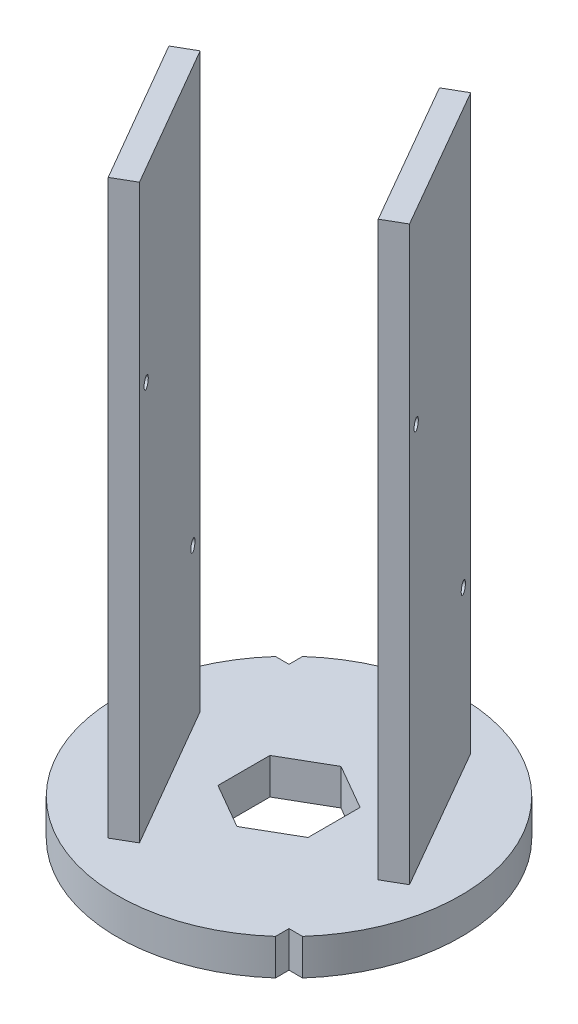
ISO-10303-21;
HEADER;
FILE_DESCRIPTION(('STEP AP214'),'2;1');
FILE_NAME('part.step','',(''),(''),'','','');
FILE_SCHEMA(('AUTOMOTIVE_DESIGN { 1 0 10303 214 1 1 1 1 }'));
ENDSEC;
DATA;
#1=APPLICATION_CONTEXT('core data for automotive mechanical design processes');
#2=APPLICATION_PROTOCOL_DEFINITION('international standard','automotive_design',2000,#1);
#3=PRODUCT_CONTEXT('',#1,'mechanical');
#4=PRODUCT('Part','Part','',(#3));
#5=PRODUCT_RELATED_PRODUCT_CATEGORY('part','',(#4));
#6=PRODUCT_DEFINITION_FORMATION('','',#4);
#7=PRODUCT_DEFINITION_CONTEXT('part definition',#1,'design');
#8=PRODUCT_DEFINITION('design','',#6,#7);
#9=PRODUCT_DEFINITION_SHAPE('','',#8);
#10=(LENGTH_UNIT() NAMED_UNIT(*) SI_UNIT(.MILLI.,.METRE.));
#11=(NAMED_UNIT(*) PLANE_ANGLE_UNIT() SI_UNIT($,.RADIAN.));
#12=(NAMED_UNIT(*) SI_UNIT($,.STERADIAN.) SOLID_ANGLE_UNIT());
#13=UNCERTAINTY_MEASURE_WITH_UNIT(LENGTH_MEASURE(1.E-05),#10,'distance_accuracy_value','');
#14=(GEOMETRIC_REPRESENTATION_CONTEXT(3) GLOBAL_UNCERTAINTY_ASSIGNED_CONTEXT((#13)) GLOBAL_UNIT_ASSIGNED_CONTEXT((#10,
#11,#12)) REPRESENTATION_CONTEXT('',''));
#15=CARTESIAN_POINT('',(0.,0.,0.));
#16=DIRECTION('',(0.,0.,1.));
#17=DIRECTION('',(1.,0.,0.));
#18=AXIS2_PLACEMENT_3D('',#15,#16,#17);
#19=CARTESIAN_POINT('',(5.00000000000001,8.,-8.6602540378444));
#20=DIRECTION('',(-0.5,0.,0.866025403784439));
#21=DIRECTION('',(0.866025403784439,0.,0.5));
#22=AXIS2_PLACEMENT_3D('',#19,#20,#21);
#23=PLANE('',#22);
#24=DIRECTION('',(-0.866025403784439,0.,-0.5));
#25=VECTOR('',#24,1.);
#26=CARTESIAN_POINT('',(5.00000000000001,0.,-8.6602540378444));
#27=LINE('',#26,#25);
#28=CARTESIAN_POINT('',(10.,0.,-5.77350269189628));
#29=VERTEX_POINT('',#28);
#30=CARTESIAN_POINT('',(0.,0.,-11.5470053837925));
#31=VERTEX_POINT('',#30);
#32=EDGE_CURVE('E347',#29,#31,#27,.T.);
#33=ORIENTED_EDGE('',*,*,#32,.F.);
#34=DIRECTION('',(0.,-1.,0.));
#35=VECTOR('',#34,1.);
#36=CARTESIAN_POINT('',(10.,8.,-5.77350269189628));
#37=LINE('',#36,#35);
#38=CARTESIAN_POINT('',(10.,8.,-5.77350269189628));
#39=VERTEX_POINT('',#38);
#40=EDGE_CURVE('E11',#39,#29,#37,.T.);
#41=ORIENTED_EDGE('',*,*,#40,.F.);
#42=DIRECTION('',(-0.866025403784439,0.,-0.5));
#43=VECTOR('',#42,1.);
#44=CARTESIAN_POINT('',(5.00000000000001,8.,-8.6602540378444));
#45=LINE('',#44,#43);
#46=CARTESIAN_POINT('',(0.,8.,-11.5470053837925));
#47=VERTEX_POINT('',#46);
#48=EDGE_CURVE('E300',#39,#47,#45,.T.);
#49=ORIENTED_EDGE('',*,*,#48,.T.);
#50=DIRECTION('',(0.,-1.,0.));
#51=VECTOR('',#50,1.);
#52=CARTESIAN_POINT('',(0.,8.,-11.5470053837925));
#53=LINE('',#52,#51);
#54=EDGE_CURVE('E370',#47,#31,#53,.T.);
#55=ORIENTED_EDGE('',*,*,#54,.T.);
#56=EDGE_LOOP('',(#33,#41,#49,#55));
#57=FACE_BOUND('',#56,.T.);
#58=ADVANCED_FACE('F43',(#57),#23,.T.);
#59=CARTESIAN_POINT('',(10.,8.,0.));
#60=DIRECTION('',(-1.,0.,0.));
#61=DIRECTION('',(0.,0.,1.));
#62=AXIS2_PLACEMENT_3D('',#59,#60,#61);
#63=PLANE('',#62);
#64=DIRECTION('',(0.,0.,-1.));
#65=VECTOR('',#64,1.);
#66=CARTESIAN_POINT('',(10.,0.,0.));
#67=LINE('',#66,#65);
#68=CARTESIAN_POINT('',(9.99999999999999,0.,5.77350269189625));
#69=VERTEX_POINT('',#68);
#70=EDGE_CURVE('E351',#69,#29,#67,.T.);
#71=ORIENTED_EDGE('',*,*,#70,.F.);
#72=DIRECTION('',(0.,-1.,0.));
#73=VECTOR('',#72,1.);
#74=CARTESIAN_POINT('',(9.99999999999999,8.,5.77350269189625));
#75=LINE('',#74,#73);
#76=CARTESIAN_POINT('',(9.99999999999999,8.,5.77350269189625));
#77=VERTEX_POINT('',#76);
#78=EDGE_CURVE('E53',#77,#69,#75,.T.);
#79=ORIENTED_EDGE('',*,*,#78,.F.);
#80=DIRECTION('',(0.,0.,-1.));
#81=VECTOR('',#80,1.);
#82=CARTESIAN_POINT('',(10.,8.,0.));
#83=LINE('',#82,#81);
#84=EDGE_CURVE('E304',#77,#39,#83,.T.);
#85=ORIENTED_EDGE('',*,*,#84,.T.);
#86=ORIENTED_EDGE('',*,*,#40,.T.);
#87=EDGE_LOOP('',(#71,#79,#85,#86));
#88=FACE_BOUND('',#87,.T.);
#89=ADVANCED_FACE('F441',(#88),#63,.T.);
#90=CARTESIAN_POINT('',(4.99999999999999,8.,8.66025403784438));
#91=DIRECTION('',(-0.5,0.,-0.866025403784439));
#92=DIRECTION('',(-0.866025403784439,0.,0.5));
#93=AXIS2_PLACEMENT_3D('',#90,#91,#92);
#94=PLANE('',#93);
#95=DIRECTION('',(0.866025403784439,0.,-0.5));
#96=VECTOR('',#95,1.);
#97=CARTESIAN_POINT('',(4.99999999999999,0.,8.66025403784438));
#98=LINE('',#97,#96);
#99=CARTESIAN_POINT('',(0.,0.,11.5470053837925));
#100=VERTEX_POINT('',#99);
#101=EDGE_CURVE('E355',#100,#69,#98,.T.);
#102=ORIENTED_EDGE('',*,*,#101,.F.);
#103=DIRECTION('',(0.,-1.,0.));
#104=VECTOR('',#103,1.);
#105=CARTESIAN_POINT('',(0.,8.,11.5470053837925));
#106=LINE('',#105,#104);
#107=CARTESIAN_POINT('',(0.,8.,11.5470053837925));
#108=VERTEX_POINT('',#107);
#109=EDGE_CURVE('E379',#108,#100,#106,.T.);
#110=ORIENTED_EDGE('',*,*,#109,.F.);
#111=DIRECTION('',(0.866025403784439,0.,-0.5));
#112=VECTOR('',#111,1.);
#113=CARTESIAN_POINT('',(4.99999999999999,8.,8.66025403784438));
#114=LINE('',#113,#112);
#115=EDGE_CURVE('E308',#108,#77,#114,.T.);
#116=ORIENTED_EDGE('',*,*,#115,.T.);
#117=ORIENTED_EDGE('',*,*,#78,.T.);
#118=EDGE_LOOP('',(#102,#110,#116,#117));
#119=FACE_BOUND('',#118,.T.);
#120=ADVANCED_FACE('F445',(#119),#94,.T.);
#121=CARTESIAN_POINT('',(-5.,8.,8.66025403784438));
#122=DIRECTION('',(0.5,0.,-0.866025403784439));
#123=DIRECTION('',(-0.866025403784439,0.,-0.5));
#124=AXIS2_PLACEMENT_3D('',#121,#122,#123);
#125=PLANE('',#124);
#126=DIRECTION('',(0.866025403784439,0.,0.5));
#127=VECTOR('',#126,1.);
#128=CARTESIAN_POINT('',(-5.,0.,8.66025403784438));
#129=LINE('',#128,#127);
#130=CARTESIAN_POINT('',(-10.,0.,5.77350269189625));
#131=VERTEX_POINT('',#130);
#132=EDGE_CURVE('E359',#131,#100,#129,.T.);
#133=ORIENTED_EDGE('',*,*,#132,.F.);
#134=DIRECTION('',(0.,-1.,0.));
#135=VECTOR('',#134,1.);
#136=CARTESIAN_POINT('',(-10.,8.,5.77350269189625));
#137=LINE('',#136,#135);
#138=CARTESIAN_POINT('',(-10.,8.,5.77350269189625));
#139=VERTEX_POINT('',#138);
#140=EDGE_CURVE('E376',#139,#131,#137,.T.);
#141=ORIENTED_EDGE('',*,*,#140,.F.);
#142=DIRECTION('',(0.866025403784439,0.,0.5));
#143=VECTOR('',#142,1.);
#144=CARTESIAN_POINT('',(-5.,8.,8.66025403784438));
#145=LINE('',#144,#143);
#146=EDGE_CURVE('E312',#139,#108,#145,.T.);
#147=ORIENTED_EDGE('',*,*,#146,.T.);
#148=ORIENTED_EDGE('',*,*,#109,.T.);
#149=EDGE_LOOP('',(#133,#141,#147,#148));
#150=FACE_BOUND('',#149,.T.);
#151=ADVANCED_FACE('F449',(#150),#125,.T.);
#152=CARTESIAN_POINT('',(-10.,8.,0.));
#153=DIRECTION('',(1.,0.,0.));
#154=DIRECTION('',(0.,0.,-1.));
#155=AXIS2_PLACEMENT_3D('',#152,#153,#154);
#156=PLANE('',#155);
#157=DIRECTION('',(0.,0.,1.));
#158=VECTOR('',#157,1.);
#159=CARTESIAN_POINT('',(-10.,0.,0.));
#160=LINE('',#159,#158);
#161=CARTESIAN_POINT('',(-10.,0.,-5.77350269189628));
#162=VERTEX_POINT('',#161);
#163=EDGE_CURVE('E363',#162,#131,#160,.T.);
#164=ORIENTED_EDGE('',*,*,#163,.F.);
#165=DIRECTION('',(0.,-1.,0.));
#166=VECTOR('',#165,1.);
#167=CARTESIAN_POINT('',(-10.,8.,-5.77350269189628));
#168=LINE('',#167,#166);
#169=CARTESIAN_POINT('',(-10.,8.,-5.77350269189628));
#170=VERTEX_POINT('',#169);
#171=EDGE_CURVE('E373',#170,#162,#168,.T.);
#172=ORIENTED_EDGE('',*,*,#171,.F.);
#173=DIRECTION('',(0.,0.,1.));
#174=VECTOR('',#173,1.);
#175=CARTESIAN_POINT('',(-10.,8.,0.));
#176=LINE('',#175,#174);
#177=EDGE_CURVE('E316',#170,#139,#176,.T.);
#178=ORIENTED_EDGE('',*,*,#177,.T.);
#179=ORIENTED_EDGE('',*,*,#140,.T.);
#180=EDGE_LOOP('',(#164,#172,#178,#179));
#181=FACE_BOUND('',#180,.T.);
#182=ADVANCED_FACE('F452',(#181),#156,.T.);
#183=CARTESIAN_POINT('',(0.,8.,-25.4));
#184=DIRECTION('',(0.,0.,1.));
#185=DIRECTION('',(1.,0.,0.));
#186=AXIS2_PLACEMENT_3D('',#183,#184,#185);
#187=PLANE('',#186);
#188=DIRECTION('',(-1.,0.,0.));
#189=VECTOR('',#188,1.);
#190=CARTESIAN_POINT('',(0.,0.,-25.4));
#191=LINE('',#190,#189);
#192=CARTESIAN_POINT('',(-25.4,0.,-25.4));
#193=VERTEX_POINT('',#192);
#194=CARTESIAN_POINT('',(-28.3980633142473,0.,-25.4));
#195=VERTEX_POINT('',#194);
#196=EDGE_CURVE('E277',#193,#195,#191,.T.);
#197=ORIENTED_EDGE('',*,*,#196,.T.);
#198=DIRECTION('',(0.,-1.,0.));
#199=VECTOR('',#198,1.);
#200=CARTESIAN_POINT('',(-28.3980633142473,8.,-25.4));
#201=LINE('',#200,#199);
#202=CARTESIAN_POINT('',(-28.3980633142473,8.,-25.4));
#203=VERTEX_POINT('',#202);
#204=EDGE_CURVE('E47',#203,#195,#201,.T.);
#205=ORIENTED_EDGE('',*,*,#204,.F.);
#206=DIRECTION('',(-1.,0.,0.));
#207=VECTOR('',#206,1.);
#208=CARTESIAN_POINT('',(0.,8.,-25.4));
#209=LINE('',#208,#207);
#210=CARTESIAN_POINT('',(-25.4,8.,-25.4));
#211=VERTEX_POINT('',#210);
#212=EDGE_CURVE('E278',#211,#203,#209,.T.);
#213=ORIENTED_EDGE('',*,*,#212,.F.);
#214=DIRECTION('',(0.,-1.,0.));
#215=VECTOR('',#214,1.);
#216=CARTESIAN_POINT('',(-25.4,8.,-25.4));
#217=LINE('',#216,#215);
#218=EDGE_CURVE('E324',#211,#193,#217,.T.);
#219=ORIENTED_EDGE('',*,*,#218,.T.);
#220=EDGE_LOOP('',(#197,#205,#213,#219));
#221=FACE_BOUND('',#220,.T.);
#222=ADVANCED_FACE('F45',(#221),#187,.F.);
#223=CARTESIAN_POINT('',(0.,8.,0.));
#224=DIRECTION('',(0.,-1.,0.));
#225=DIRECTION('',(0.,0.,-1.));
#226=AXIS2_PLACEMENT_3D('',#223,#224,#225);
#227=CYLINDRICAL_SURFACE('',#226,38.1);
#228=CARTESIAN_POINT('',(0.,0.,0.));
#229=DIRECTION('',(0.,1.,0.));
#230=DIRECTION('',(0.,0.,1.));
#231=AXIS2_PLACEMENT_3D('',#228,#229,#230);
#232=CIRCLE('',#231,38.1);
#233=CARTESIAN_POINT('',(25.4,0.,28.3980633142473));
#234=VERTEX_POINT('',#233);
#235=EDGE_CURVE('E328',#195,#234,#232,.T.);
#236=ORIENTED_EDGE('',*,*,#235,.T.);
#237=DIRECTION('',(0.,-1.,0.));
#238=VECTOR('',#237,1.);
#239=CARTESIAN_POINT('',(25.4,8.,28.3980633142473));
#240=LINE('',#239,#238);
#241=CARTESIAN_POINT('',(25.4,8.,28.3980633142473));
#242=VERTEX_POINT('',#241);
#243=EDGE_CURVE('E395',#242,#234,#240,.T.);
#244=ORIENTED_EDGE('',*,*,#243,.F.);
#245=CARTESIAN_POINT('',(0.,8.,0.));
#246=DIRECTION('',(0.,1.,0.));
#247=DIRECTION('',(0.,0.,1.));
#248=AXIS2_PLACEMENT_3D('',#245,#246,#247);
#249=CIRCLE('',#248,38.1);
#250=EDGE_CURVE('E282',#203,#242,#249,.T.);
#251=ORIENTED_EDGE('',*,*,#250,.F.);
#252=ORIENTED_EDGE('',*,*,#204,.T.);
#253=EDGE_LOOP('',(#236,#244,#251,#252));
#254=FACE_BOUND('',#253,.T.);
#255=ADVANCED_FACE('F404',(#254),#227,.T.);
#256=CARTESIAN_POINT('',(25.4,8.,0.));
#257=DIRECTION('',(1.,0.,0.));
#258=DIRECTION('',(0.,0.,-1.));
#259=AXIS2_PLACEMENT_3D('',#256,#257,#258);
#260=PLANE('',#259);
#261=DIRECTION('',(0.,0.,1.));
#262=VECTOR('',#261,1.);
#263=CARTESIAN_POINT('',(25.4,0.,0.));
#264=LINE('',#263,#262);
#265=CARTESIAN_POINT('',(25.4,0.,25.4));
#266=VERTEX_POINT('',#265);
#267=EDGE_CURVE('E332',#266,#234,#264,.T.);
#268=ORIENTED_EDGE('',*,*,#267,.F.);
#269=DIRECTION('',(0.,-1.,0.));
#270=VECTOR('',#269,1.);
#271=CARTESIAN_POINT('',(25.4,8.,25.4));
#272=LINE('',#271,#270);
#273=CARTESIAN_POINT('',(25.4,8.,25.4));
#274=VERTEX_POINT('',#273);
#275=EDGE_CURVE('E393',#274,#266,#272,.T.);
#276=ORIENTED_EDGE('',*,*,#275,.F.);
#277=DIRECTION('',(0.,0.,1.));
#278=VECTOR('',#277,1.);
#279=CARTESIAN_POINT('',(25.4,8.,0.));
#280=LINE('',#279,#278);
#281=EDGE_CURVE('E286',#274,#242,#280,.T.);
#282=ORIENTED_EDGE('',*,*,#281,.T.);
#283=ORIENTED_EDGE('',*,*,#243,.T.);
#284=EDGE_LOOP('',(#268,#276,#282,#283));
#285=FACE_BOUND('',#284,.T.);
#286=ADVANCED_FACE('F423',(#285),#260,.T.);
#287=CARTESIAN_POINT('',(0.,8.,25.4));
#288=DIRECTION('',(0.,0.,-1.));
#289=DIRECTION('',(-1.,0.,0.));
#290=AXIS2_PLACEMENT_3D('',#287,#288,#289);
#291=PLANE('',#290);
#292=DIRECTION('',(1.,0.,0.));
#293=VECTOR('',#292,1.);
#294=CARTESIAN_POINT('',(0.,0.,25.4));
#295=LINE('',#294,#293);
#296=CARTESIAN_POINT('',(28.3980633142473,0.,25.4));
#297=VERTEX_POINT('',#296);
#298=EDGE_CURVE('E336',#266,#297,#295,.T.);
#299=ORIENTED_EDGE('',*,*,#298,.T.);
#300=DIRECTION('',(0.,-1.,0.));
#301=VECTOR('',#300,1.);
#302=CARTESIAN_POINT('',(28.3980633142473,8.,25.4));
#303=LINE('',#302,#301);
#304=CARTESIAN_POINT('',(28.3980633142473,8.,25.4));
#305=VERTEX_POINT('',#304);
#306=EDGE_CURVE('E389',#305,#297,#303,.T.);
#307=ORIENTED_EDGE('',*,*,#306,.F.);
#308=DIRECTION('',(1.,0.,0.));
#309=VECTOR('',#308,1.);
#310=CARTESIAN_POINT('',(0.,8.,25.4));
#311=LINE('',#310,#309);
#312=EDGE_CURVE('E290',#274,#305,#311,.T.);
#313=ORIENTED_EDGE('',*,*,#312,.F.);
#314=ORIENTED_EDGE('',*,*,#275,.T.);
#315=EDGE_LOOP('',(#299,#307,#313,#314));
#316=FACE_BOUND('',#315,.T.);
#317=ADVANCED_FACE('F426',(#316),#291,.F.);
#318=CARTESIAN_POINT('',(0.,8.,0.));
#319=DIRECTION('',(0.,-1.,0.));
#320=DIRECTION('',(0.,0.,-1.));
#321=AXIS2_PLACEMENT_3D('',#318,#319,#320);
#322=CYLINDRICAL_SURFACE('',#321,38.1);
#323=CARTESIAN_POINT('',(0.,0.,0.));
#324=DIRECTION('',(0.,1.,0.));
#325=DIRECTION('',(0.,0.,1.));
#326=AXIS2_PLACEMENT_3D('',#323,#324,#325);
#327=CIRCLE('',#326,38.1);
#328=CARTESIAN_POINT('',(-25.4,0.,-28.3980633142473));
#329=VERTEX_POINT('',#328);
#330=EDGE_CURVE('E339',#297,#329,#327,.T.);
#331=ORIENTED_EDGE('',*,*,#330,.T.);
#332=DIRECTION('',(0.,-1.,0.));
#333=VECTOR('',#332,1.);
#334=CARTESIAN_POINT('',(-25.4,8.,-28.3980633142473));
#335=LINE('',#334,#333);
#336=CARTESIAN_POINT('',(-25.4,8.,-28.3980633142473));
#337=VERTEX_POINT('',#336);
#338=EDGE_CURVE('E386',#337,#329,#335,.T.);
#339=ORIENTED_EDGE('',*,*,#338,.F.);
#340=CARTESIAN_POINT('',(0.,8.,0.));
#341=DIRECTION('',(0.,1.,0.));
#342=DIRECTION('',(0.,0.,1.));
#343=AXIS2_PLACEMENT_3D('',#340,#341,#342);
#344=CIRCLE('',#343,38.1);
#345=EDGE_CURVE('E293',#305,#337,#344,.T.);
#346=ORIENTED_EDGE('',*,*,#345,.F.);
#347=ORIENTED_EDGE('',*,*,#306,.T.);
#348=EDGE_LOOP('',(#331,#339,#346,#347));
#349=FACE_BOUND('',#348,.T.);
#350=ADVANCED_FACE('F419',(#349),#322,.T.);
#351=CARTESIAN_POINT('',(-25.4,8.,0.));
#352=DIRECTION('',(-1.,0.,0.));
#353=DIRECTION('',(0.,0.,1.));
#354=AXIS2_PLACEMENT_3D('',#351,#352,#353);
#355=PLANE('',#354);
#356=DIRECTION('',(0.,0.,-1.));
#357=VECTOR('',#356,1.);
#358=CARTESIAN_POINT('',(-25.4,0.,0.));
#359=LINE('',#358,#357);
#360=EDGE_CURVE('E343',#193,#329,#359,.T.);
#361=ORIENTED_EDGE('',*,*,#360,.F.);
#362=ORIENTED_EDGE('',*,*,#218,.F.);
#363=DIRECTION('',(0.,0.,-1.));
#364=VECTOR('',#363,1.);
#365=CARTESIAN_POINT('',(-25.4,8.,0.));
#366=LINE('',#365,#364);
#367=EDGE_CURVE('E296',#211,#337,#366,.T.);
#368=ORIENTED_EDGE('',*,*,#367,.T.);
#369=ORIENTED_EDGE('',*,*,#338,.T.);
#370=EDGE_LOOP('',(#361,#362,#368,#369));
#371=FACE_BOUND('',#370,.T.);
#372=ADVANCED_FACE('F414',(#371),#355,.T.);
#373=CARTESIAN_POINT('',(-5.,8.,-8.66025403784441));
#374=DIRECTION('',(0.499999999999999,0.,0.866025403784439));
#375=DIRECTION('',(0.866025403784439,0.,-0.499999999999999));
#376=AXIS2_PLACEMENT_3D('',#373,#374,#375);
#377=PLANE('',#376);
#378=DIRECTION('',(-0.866025403784439,0.,0.499999999999999));
#379=VECTOR('',#378,1.);
#380=CARTESIAN_POINT('',(-5.,0.,-8.66025403784441));
#381=LINE('',#380,#379);
#382=EDGE_CURVE('E283',#31,#162,#381,.T.);
#383=ORIENTED_EDGE('',*,*,#382,.F.);
#384=ORIENTED_EDGE('',*,*,#54,.F.);
#385=DIRECTION('',(-0.866025403784439,0.,0.499999999999999));
#386=VECTOR('',#385,1.);
#387=CARTESIAN_POINT('',(-5.,8.,-8.66025403784441));
#388=LINE('',#387,#386);
#389=EDGE_CURVE('E320',#47,#170,#388,.T.);
#390=ORIENTED_EDGE('',*,*,#389,.T.);
#391=ORIENTED_EDGE('',*,*,#171,.T.);
#392=EDGE_LOOP('',(#383,#384,#390,#391));
#393=FACE_BOUND('',#392,.T.);
#394=ADVANCED_FACE('F431',(#393),#377,.T.);
#395=CARTESIAN_POINT('',(0.,8.,0.));
#396=DIRECTION('',(0.,1.,0.));
#397=DIRECTION('',(0.,0.,1.));
#398=AXIS2_PLACEMENT_3D('',#395,#396,#397);
#399=PLANE('',#398);
#400=DIRECTION('',(0.866596907699709,0.,-0.499008817121804));
#401=VECTOR('',#400,1.);
#402=CARTESIAN_POINT('',(11.8969756269813,7.99999999999999,-28.4337007189567));
#403=LINE('',#402,#401);
#404=CARTESIAN_POINT('',(7.49466333586674,8.,-25.8987359279779));
#405=VERTEX_POINT('',#404);
#406=CARTESIAN_POINT('',(11.8969756269813,7.99999999999999,-28.4337007189567));
#407=VERTEX_POINT('',#406);
#408=EDGE_CURVE('E187',#405,#407,#403,.T.);
#409=ORIENTED_EDGE('',*,*,#408,.T.);
#410=DIRECTION('',(0.499008817121804,0.,0.866596907699709));
#411=VECTOR('',#410,1.);
#412=CARTESIAN_POINT('',(11.8969756269813,7.99999999999999,-28.4337007189567));
#413=LINE('',#412,#411);
#414=CARTESIAN_POINT('',(30.3407738621131,8.,3.59647183188471));
#415=VERTEX_POINT('',#414);
#416=EDGE_CURVE('E203',#407,#415,#413,.T.);
#417=ORIENTED_EDGE('',*,*,#416,.T.);
#418=DIRECTION('',(-0.866596907699709,0.,0.499008817121804));
#419=VECTOR('',#418,1.);
#420=CARTESIAN_POINT('',(30.3407738621131,7.99999999999999,3.59647183188472));
#421=LINE('',#420,#419);
#422=CARTESIAN_POINT('',(25.9384615709986,8.,6.13143662286348));
#423=VERTEX_POINT('',#422);
#424=EDGE_CURVE('E66',#415,#423,#421,.T.);
#425=ORIENTED_EDGE('',*,*,#424,.T.);
#426=DIRECTION('',(-0.499008817121804,0.,-0.866596907699709));
#427=VECTOR('',#426,1.);
#428=CARTESIAN_POINT('',(7.49466333586675,7.99999999999999,-25.8987359279779));
#429=LINE('',#428,#427);
#430=EDGE_CURVE('E61',#423,#405,#429,.T.);
#431=ORIENTED_EDGE('',*,*,#430,.T.);
#432=EDGE_LOOP('',(#409,#417,#425,#431));
#433=FACE_BOUND('',#432,.T.);
#434=DIRECTION('',(-0.86545276618976,0.,0.500990528348084));
#435=VECTOR('',#434,1.);
#436=CARTESIAN_POINT('',(-30.572794959711,8.,-3.91376723830827));
#437=LINE('',#436,#435);
#438=CARTESIAN_POINT('',(-26.176294907467,8.,-6.45879912231654));
#439=VERTEX_POINT('',#438);
#440=CARTESIAN_POINT('',(-30.572794959711,8.,-3.91376723830827));
#441=VERTEX_POINT('',#440);
#442=EDGE_CURVE('E191',#439,#441,#437,.T.);
#443=ORIENTED_EDGE('',*,*,#442,.F.);
#444=DIRECTION('',(-0.500990528348084,0.,-0.86545276618976));
#445=VECTOR('',#444,1.);
#446=CARTESIAN_POINT('',(-26.176294907467,8.,-6.45879912231654));
#447=LINE('',#446,#445);
#448=CARTESIAN_POINT('',(-7.65925090840529,8.,25.5290849670029));
#449=VERTEX_POINT('',#448);
#450=EDGE_CURVE('E238',#449,#439,#447,.T.);
#451=ORIENTED_EDGE('',*,*,#450,.F.);
#452=DIRECTION('',(0.86545276618976,0.,-0.500990528348084));
#453=VECTOR('',#452,1.);
#454=CARTESIAN_POINT('',(-12.0557509606493,8.,28.0741168510112));
#455=LINE('',#454,#453);
#456=CARTESIAN_POINT('',(-12.0557509606493,8.,28.0741168510112));
#457=VERTEX_POINT('',#456);
#458=EDGE_CURVE('E255',#457,#449,#455,.T.);
#459=ORIENTED_EDGE('',*,*,#458,.F.);
#460=DIRECTION('',(0.500990528348084,0.,0.86545276618976));
#461=VECTOR('',#460,1.);
#462=CARTESIAN_POINT('',(-30.572794959711,8.,-3.91376723830827));
#463=LINE('',#462,#461);
#464=EDGE_CURVE('E251',#441,#457,#463,.T.);
#465=ORIENTED_EDGE('',*,*,#464,.F.);
#466=EDGE_LOOP('',(#443,#451,#459,#465));
#467=FACE_BOUND('',#466,.T.);
#468=ORIENTED_EDGE('',*,*,#212,.T.);
#469=ORIENTED_EDGE('',*,*,#250,.T.);
#470=ORIENTED_EDGE('',*,*,#281,.F.);
#471=ORIENTED_EDGE('',*,*,#312,.T.);
#472=ORIENTED_EDGE('',*,*,#345,.T.);
#473=ORIENTED_EDGE('',*,*,#367,.F.);
#474=EDGE_LOOP('',(#468,#469,#470,#471,#472,#473));
#475=FACE_BOUND('',#474,.T.);
#476=ORIENTED_EDGE('',*,*,#48,.F.);
#477=ORIENTED_EDGE('',*,*,#84,.F.);
#478=ORIENTED_EDGE('',*,*,#115,.F.);
#479=ORIENTED_EDGE('',*,*,#146,.F.);
#480=ORIENTED_EDGE('',*,*,#177,.F.);
#481=ORIENTED_EDGE('',*,*,#389,.F.);
#482=EDGE_LOOP('',(#476,#477,#478,#479,#480,#481));
#483=FACE_BOUND('',#482,.T.);
#484=ADVANCED_FACE('F428',(#433,#467,#475,#483),#399,.T.);
#485=CARTESIAN_POINT('',(0.,0.,0.));
#486=DIRECTION('',(0.,1.,0.));
#487=DIRECTION('',(0.,0.,1.));
#488=AXIS2_PLACEMENT_3D('',#485,#486,#487);
#489=PLANE('',#488);
#490=ORIENTED_EDGE('',*,*,#196,.F.);
#491=ORIENTED_EDGE('',*,*,#360,.T.);
#492=ORIENTED_EDGE('',*,*,#330,.F.);
#493=ORIENTED_EDGE('',*,*,#298,.F.);
#494=ORIENTED_EDGE('',*,*,#267,.T.);
#495=ORIENTED_EDGE('',*,*,#235,.F.);
#496=EDGE_LOOP('',(#490,#491,#492,#493,#494,#495));
#497=FACE_BOUND('',#496,.T.);
#498=ORIENTED_EDGE('',*,*,#32,.T.);
#499=ORIENTED_EDGE('',*,*,#382,.T.);
#500=ORIENTED_EDGE('',*,*,#163,.T.);
#501=ORIENTED_EDGE('',*,*,#132,.T.);
#502=ORIENTED_EDGE('',*,*,#101,.T.);
#503=ORIENTED_EDGE('',*,*,#70,.T.);
#504=EDGE_LOOP('',(#498,#499,#500,#501,#502,#503));
#505=FACE_BOUND('',#504,.T.);
#506=ADVANCED_FACE('F410',(#497,#505),#489,.F.);
#507=CARTESIAN_POINT('',(-30.572794959711,135.,-3.91376723830827));
#508=DIRECTION('',(0.500990528348084,0.,0.86545276618976));
#509=DIRECTION('',(0.86545276618976,0.,-0.500990528348084));
#510=AXIS2_PLACEMENT_3D('',#507,#508,#509);
#511=PLANE('',#510);
#512=ORIENTED_EDGE('',*,*,#442,.T.);
#513=DIRECTION('',(0.,-1.,0.));
#514=VECTOR('',#513,1.);
#515=CARTESIAN_POINT('',(-30.572794959711,135.,-3.91376723830827));
#516=LINE('',#515,#514);
#517=CARTESIAN_POINT('',(-30.572794959711,135.,-3.91376723830827));
#518=VERTEX_POINT('',#517);
#519=EDGE_CURVE('E273',#518,#441,#516,.T.);
#520=ORIENTED_EDGE('',*,*,#519,.F.);
#521=DIRECTION('',(-0.86545276618976,0.,0.500990528348084));
#522=VECTOR('',#521,1.);
#523=CARTESIAN_POINT('',(-30.572794959711,135.,-3.91376723830827));
#524=LINE('',#523,#522);
#525=CARTESIAN_POINT('',(-26.176294907467,135.,-6.45879912231654));
#526=VERTEX_POINT('',#525);
#527=EDGE_CURVE('E233',#526,#518,#524,.T.);
#528=ORIENTED_EDGE('',*,*,#527,.F.);
#529=DIRECTION('',(0.,-1.,0.));
#530=VECTOR('',#529,1.);
#531=CARTESIAN_POINT('',(-26.176294907467,135.,-6.45879912231654));
#532=LINE('',#531,#530);
#533=EDGE_CURVE('E247',#526,#439,#532,.T.);
#534=ORIENTED_EDGE('',*,*,#533,.T.);
#535=EDGE_LOOP('',(#512,#520,#528,#534));
#536=FACE_BOUND('',#535,.T.);
#537=ADVANCED_FACE('F456',(#536),#511,.F.);
#538=CARTESIAN_POINT('',(-30.572794959711,135.,-3.91376723830827));
#539=DIRECTION('',(0.86545276618976,0.,-0.500990528348084));
#540=DIRECTION('',(-0.500990528348084,0.,-0.86545276618976));
#541=AXIS2_PLACEMENT_3D('',#538,#539,#540);
#542=PLANE('',#541);
#543=CARTESIAN_POINT('',(-14.1152392528382,93.725,24.5163852402213));
#544=DIRECTION('',(0.86545276618976,0.,-0.500990528348084));
#545=DIRECTION('',(0.500990528348084,-1.02586609897164E-13,0.86545276618976));
#546=AXIS2_PLACEMENT_3D('',#543,#544,#545);
#547=ELLIPSE('',#546,1.27000332502058,1.27);
#548=CARTESIAN_POINT('',(-13.4789796160323,93.7249999999999,25.6155131309305));
#549=VERTEX_POINT('',#548);
#550=EDGE_CURVE('E218',#549,#549,#547,.T.);
#551=ORIENTED_EDGE('',*,*,#550,.T.);
#552=EDGE_LOOP('',(#551));
#553=FACE_BOUND('',#552,.T.);
#554=CARTESIAN_POINT('',(-28.3674457887856,42.925,-0.104063396830577));
#555=DIRECTION('',(0.86545276618976,0.,-0.500990528348084));
#556=DIRECTION('',(0.500990528348084,-1.02586609897164E-13,0.86545276618976));
#557=AXIS2_PLACEMENT_3D('',#554,#555,#556);
#558=ELLIPSE('',#557,1.27000332502058,1.27);
#559=CARTESIAN_POINT('',(-27.7311861519797,42.9249999999999,0.995064493878677));
#560=VERTEX_POINT('',#559);
#561=EDGE_CURVE('E704',#560,#560,#558,.T.);
#562=ORIENTED_EDGE('',*,*,#561,.T.);
#563=EDGE_LOOP('',(#562));
#564=FACE_BOUND('',#563,.T.);
#565=ORIENTED_EDGE('',*,*,#464,.T.);
#566=DIRECTION('',(0.,-1.,0.));
#567=VECTOR('',#566,1.);
#568=CARTESIAN_POINT('',(-12.0557509606493,135.,28.0741168510112));
#569=LINE('',#568,#567);
#570=CARTESIAN_POINT('',(-12.0557509606493,135.,28.0741168510112));
#571=VERTEX_POINT('',#570);
#572=EDGE_CURVE('E269',#571,#457,#569,.T.);
#573=ORIENTED_EDGE('',*,*,#572,.F.);
#574=DIRECTION('',(0.500990528348084,0.,0.86545276618976));
#575=VECTOR('',#574,1.);
#576=CARTESIAN_POINT('',(-30.572794959711,135.,-3.91376723830827));
#577=LINE('',#576,#575);
#578=EDGE_CURVE('E237',#518,#571,#577,.T.);
#579=ORIENTED_EDGE('',*,*,#578,.F.);
#580=ORIENTED_EDGE('',*,*,#519,.T.);
#581=EDGE_LOOP('',(#565,#573,#579,#580));
#582=FACE_BOUND('',#581,.T.);
#583=ADVANCED_FACE('F461',(#553,#564,#582),#542,.F.);
#584=CARTESIAN_POINT('',(-12.0557509606493,135.,28.0741168510112));
#585=DIRECTION('',(-0.500990528348084,0.,-0.86545276618976));
#586=DIRECTION('',(-0.86545276618976,0.,0.500990528348084));
#587=AXIS2_PLACEMENT_3D('',#584,#585,#586);
#588=PLANE('',#587);
#589=ORIENTED_EDGE('',*,*,#458,.T.);
#590=DIRECTION('',(0.,-1.,0.));
#591=VECTOR('',#590,1.);
#592=CARTESIAN_POINT('',(-7.65925090840529,135.,25.5290849670029));
#593=LINE('',#592,#591);
#594=CARTESIAN_POINT('',(-7.65925090840529,135.,25.5290849670029));
#595=VERTEX_POINT('',#594);
#596=EDGE_CURVE('E265',#595,#449,#593,.T.);
#597=ORIENTED_EDGE('',*,*,#596,.F.);
#598=DIRECTION('',(0.86545276618976,0.,-0.500990528348084));
#599=VECTOR('',#598,1.);
#600=CARTESIAN_POINT('',(-12.0557509606493,135.,28.0741168510112));
#601=LINE('',#600,#599);
#602=EDGE_CURVE('E241',#571,#595,#601,.T.);
#603=ORIENTED_EDGE('',*,*,#602,.F.);
#604=ORIENTED_EDGE('',*,*,#572,.T.);
#605=EDGE_LOOP('',(#589,#597,#603,#604));
#606=FACE_BOUND('',#605,.T.);
#607=ADVANCED_FACE('F563',(#606),#588,.F.);
#608=CARTESIAN_POINT('',(-26.176294907467,135.,-6.45879912231654));
#609=DIRECTION('',(-0.86545276618976,0.,0.500990528348084));
#610=DIRECTION('',(0.500990528348084,0.,0.86545276618976));
#611=AXIS2_PLACEMENT_3D('',#608,#609,#610);
#612=PLANE('',#611);
#613=CARTESIAN_POINT('',(-9.71291543591346,93.725,21.9814138123841));
#614=DIRECTION('',(-0.86545276618976,0.,0.500990528348084));
#615=DIRECTION('',(0.500990528348084,-1.02586609897159E-13,0.86545276618976));
#616=AXIS2_PLACEMENT_3D('',#613,#614,#615);
#617=ELLIPSE('',#616,1.27000332502058,1.27);
#618=CARTESIAN_POINT('',(-9.07665579910758,93.7249999999999,23.0805417030934));
#619=VERTEX_POINT('',#618);
#620=EDGE_CURVE('E693',#619,#619,#617,.T.);
#621=ORIENTED_EDGE('',*,*,#620,.T.);
#622=EDGE_LOOP('',(#621));
#623=FACE_BOUND('',#622,.T.);
#624=CARTESIAN_POINT('',(-23.9651219718609,42.925,-2.6390348246677));
#625=DIRECTION('',(-0.86545276618976,0.,0.500990528348084));
#626=DIRECTION('',(0.500990528348084,-1.02586609897159E-13,0.86545276618976));
#627=AXIS2_PLACEMENT_3D('',#624,#625,#626);
#628=ELLIPSE('',#627,1.27000332502058,1.27);
#629=CARTESIAN_POINT('',(-23.328862335055,42.9249999999999,-1.53990693395845));
#630=VERTEX_POINT('',#629);
#631=EDGE_CURVE('E708',#630,#630,#628,.T.);
#632=ORIENTED_EDGE('',*,*,#631,.T.);
#633=EDGE_LOOP('',(#632));
#634=FACE_BOUND('',#633,.T.);
#635=ORIENTED_EDGE('',*,*,#450,.T.);
#636=ORIENTED_EDGE('',*,*,#533,.F.);
#637=DIRECTION('',(-0.500990528348084,0.,-0.86545276618976));
#638=VECTOR('',#637,1.);
#639=CARTESIAN_POINT('',(-26.176294907467,135.,-6.45879912231654));
#640=LINE('',#639,#638);
#641=EDGE_CURVE('E244',#595,#526,#640,.T.);
#642=ORIENTED_EDGE('',*,*,#641,.F.);
#643=ORIENTED_EDGE('',*,*,#596,.T.);
#644=EDGE_LOOP('',(#635,#636,#642,#643));
#645=FACE_BOUND('',#644,.T.);
#646=ADVANCED_FACE('F568',(#623,#634,#645),#612,.F.);
#647=CARTESIAN_POINT('',(0.,135.,0.));
#648=DIRECTION('',(0.,-1.,0.));
#649=DIRECTION('',(0.,0.,-1.));
#650=AXIS2_PLACEMENT_3D('',#647,#648,#649);
#651=PLANE('',#650);
#652=ORIENTED_EDGE('',*,*,#527,.T.);
#653=ORIENTED_EDGE('',*,*,#578,.T.);
#654=ORIENTED_EDGE('',*,*,#602,.T.);
#655=ORIENTED_EDGE('',*,*,#641,.T.);
#656=EDGE_LOOP('',(#652,#653,#654,#655));
#657=FACE_BOUND('',#656,.T.);
#658=ADVANCED_FACE('F576',(#657),#651,.F.);
#659=CARTESIAN_POINT('',(11.8969756269813,135.,-28.4337007189567));
#660=DIRECTION('',(-0.499008817121804,0.,-0.866596907699709));
#661=DIRECTION('',(-0.866596907699709,0.,0.499008817121804));
#662=AXIS2_PLACEMENT_3D('',#659,#660,#661);
#663=PLANE('',#662);
#664=ORIENTED_EDGE('',*,*,#408,.F.);
#665=DIRECTION('',(0.,-1.,0.));
#666=VECTOR('',#665,1.);
#667=CARTESIAN_POINT('',(7.49466333586678,135.,-25.8987359279779));
#668=LINE('',#667,#666);
#669=CARTESIAN_POINT('',(7.49466333586678,135.,-25.8987359279779));
#670=VERTEX_POINT('',#669);
#671=EDGE_CURVE('E181',#670,#405,#668,.T.);
#672=ORIENTED_EDGE('',*,*,#671,.F.);
#673=DIRECTION('',(0.866596907699709,0.,-0.499008817121804));
#674=VECTOR('',#673,1.);
#675=CARTESIAN_POINT('',(11.8969756269813,135.,-28.4337007189567));
#676=LINE('',#675,#674);
#677=CARTESIAN_POINT('',(11.8969756269813,135.,-28.4337007189567));
#678=VERTEX_POINT('',#677);
#679=EDGE_CURVE('E185',#670,#678,#676,.T.);
#680=ORIENTED_EDGE('',*,*,#679,.T.);
#681=DIRECTION('',(0.,-1.,0.));
#682=VECTOR('',#681,1.);
#683=CARTESIAN_POINT('',(11.8969756269813,135.,-28.4337007189567));
#684=LINE('',#683,#682);
#685=EDGE_CURVE('E215',#678,#407,#684,.T.);
#686=ORIENTED_EDGE('',*,*,#685,.T.);
#687=EDGE_LOOP('',(#664,#672,#680,#686));
#688=FACE_BOUND('',#687,.T.);
#689=ADVANCED_FACE('F183',(#688),#663,.T.);
#690=CARTESIAN_POINT('',(7.49466333586678,135.,-25.8987359279779));
#691=DIRECTION('',(-0.866596907699709,0.,0.499008817121804));
#692=DIRECTION('',(0.499008817121804,0.,0.866596907699709));
#693=AXIS2_PLACEMENT_3D('',#690,#691,#692);
#694=PLANE('',#693);
#695=CARTESIAN_POINT('',(23.9150755047756,93.725,2.61755059939565));
#696=DIRECTION('',(-0.866596907699709,0.,0.499008817121804));
#697=DIRECTION('',(0.499008817121804,0.,0.866596907699709));
#698=AXIS2_PLACEMENT_3D('',#695,#696,#697);
#699=CIRCLE('',#698,1.27);
#700=CARTESIAN_POINT('',(24.5488167025203,93.725,3.71812867217428));
#701=VERTEX_POINT('',#700);
#702=EDGE_CURVE('E698',#701,#701,#699,.T.);
#703=ORIENTED_EDGE('',*,*,#702,.F.);
#704=EDGE_LOOP('',(#703));
#705=FACE_BOUND('',#704,.T.);
#706=CARTESIAN_POINT('',(9.71928196687494,42.925,-22.0353820947483));
#707=DIRECTION('',(-0.866596907699709,0.,0.499008817121804));
#708=DIRECTION('',(0.499008817121804,0.,0.866596907699709));
#709=AXIS2_PLACEMENT_3D('',#706,#707,#708);
#710=CIRCLE('',#709,1.27);
#711=CARTESIAN_POINT('',(10.3530231646196,42.925,-20.9348040219697));
#712=VERTEX_POINT('',#711);
#713=EDGE_CURVE('E712',#712,#712,#710,.T.);
#714=ORIENTED_EDGE('',*,*,#713,.F.);
#715=EDGE_LOOP('',(#714));
#716=FACE_BOUND('',#715,.T.);
#717=ORIENTED_EDGE('',*,*,#430,.F.);
#718=DIRECTION('',(0.,-1.,0.));
#719=VECTOR('',#718,1.);
#720=CARTESIAN_POINT('',(25.9384615709986,135.,6.13143662286347));
#721=LINE('',#720,#719);
#722=CARTESIAN_POINT('',(25.9384615709986,135.,6.13143662286347));
#723=VERTEX_POINT('',#722);
#724=EDGE_CURVE('E192',#723,#423,#721,.T.);
#725=ORIENTED_EDGE('',*,*,#724,.F.);
#726=DIRECTION('',(-0.499008817121804,0.,-0.866596907699709));
#727=VECTOR('',#726,1.);
#728=CARTESIAN_POINT('',(7.49466333586678,135.,-25.8987359279779));
#729=LINE('',#728,#727);
#730=EDGE_CURVE('E198',#723,#670,#729,.T.);
#731=ORIENTED_EDGE('',*,*,#730,.T.);
#732=ORIENTED_EDGE('',*,*,#671,.T.);
#733=EDGE_LOOP('',(#717,#725,#731,#732));
#734=FACE_BOUND('',#733,.T.);
#735=ADVANCED_FACE('F205',(#705,#716,#734),#694,.T.);
#736=CARTESIAN_POINT('',(30.3407738621132,135.,3.5964718318847));
#737=DIRECTION('',(0.499008817121804,0.,0.866596907699709));
#738=DIRECTION('',(0.866596907699709,0.,-0.499008817121804));
#739=AXIS2_PLACEMENT_3D('',#736,#737,#738);
#740=PLANE('',#739);
#741=ORIENTED_EDGE('',*,*,#424,.F.);
#742=DIRECTION('',(0.,-1.,0.));
#743=VECTOR('',#742,1.);
#744=CARTESIAN_POINT('',(30.3407738621132,135.,3.5964718318847));
#745=LINE('',#744,#743);
#746=CARTESIAN_POINT('',(30.3407738621132,135.,3.5964718318847));
#747=VERTEX_POINT('',#746);
#748=EDGE_CURVE('E227',#747,#415,#745,.T.);
#749=ORIENTED_EDGE('',*,*,#748,.F.);
#750=DIRECTION('',(-0.866596907699709,0.,0.499008817121804));
#751=VECTOR('',#750,1.);
#752=CARTESIAN_POINT('',(30.3407738621132,135.,3.5964718318847));
#753=LINE('',#752,#751);
#754=EDGE_CURVE('E207',#747,#723,#753,.T.);
#755=ORIENTED_EDGE('',*,*,#754,.T.);
#756=ORIENTED_EDGE('',*,*,#724,.T.);
#757=EDGE_LOOP('',(#741,#749,#755,#756));
#758=FACE_BOUND('',#757,.T.);
#759=ADVANCED_FACE('F604',(#758),#740,.T.);
#760=CARTESIAN_POINT('',(11.8969756269813,135.,-28.4337007189567));
#761=DIRECTION('',(0.866596907699709,0.,-0.499008817121804));
#762=DIRECTION('',(-0.499008817121804,0.,-0.866596907699709));
#763=AXIS2_PLACEMENT_3D('',#760,#761,#762);
#764=PLANE('',#763);
#765=CARTESIAN_POINT('',(28.3173877958902,93.725,0.082585808416866));
#766=DIRECTION('',(0.866596907699709,0.,-0.499008817121804));
#767=DIRECTION('',(-0.499008817121804,0.,-0.866596907699709));
#768=AXIS2_PLACEMENT_3D('',#765,#766,#767);
#769=CIRCLE('',#768,1.27);
#770=CARTESIAN_POINT('',(27.6836465981455,93.725,-1.01799226436176));
#771=VERTEX_POINT('',#770);
#772=EDGE_CURVE('E716',#771,#771,#769,.T.);
#773=ORIENTED_EDGE('',*,*,#772,.F.);
#774=EDGE_LOOP('',(#773));
#775=FACE_BOUND('',#774,.T.);
#776=CARTESIAN_POINT('',(14.1215942579895,42.925,-24.5703468857271));
#777=DIRECTION('',(0.866596907699709,0.,-0.499008817121804));
#778=DIRECTION('',(-0.499008817121804,0.,-0.866596907699709));
#779=AXIS2_PLACEMENT_3D('',#776,#777,#778);
#780=CIRCLE('',#779,1.27);
#781=CARTESIAN_POINT('',(13.4878530602448,42.925,-25.6709249585057));
#782=VERTEX_POINT('',#781);
#783=EDGE_CURVE('E717',#782,#782,#780,.T.);
#784=ORIENTED_EDGE('',*,*,#783,.F.);
#785=EDGE_LOOP('',(#784));
#786=FACE_BOUND('',#785,.T.);
#787=ORIENTED_EDGE('',*,*,#416,.F.);
#788=ORIENTED_EDGE('',*,*,#685,.F.);
#789=DIRECTION('',(0.499008817121804,0.,0.866596907699709));
#790=VECTOR('',#789,1.);
#791=CARTESIAN_POINT('',(11.8969756269813,135.,-28.4337007189567));
#792=LINE('',#791,#790);
#793=EDGE_CURVE('E201',#678,#747,#792,.T.);
#794=ORIENTED_EDGE('',*,*,#793,.T.);
#795=ORIENTED_EDGE('',*,*,#748,.T.);
#796=EDGE_LOOP('',(#787,#788,#794,#795));
#797=FACE_BOUND('',#796,.T.);
#798=ADVANCED_FACE('F609',(#775,#786,#797),#764,.T.);
#799=CARTESIAN_POINT('',(0.,135.,0.));
#800=DIRECTION('',(0.,-1.,0.));
#801=DIRECTION('',(-0.866025403784438,0.,-0.500000000000001));
#802=AXIS2_PLACEMENT_3D('',#799,#800,#801);
#803=PLANE('',#802);
#804=ORIENTED_EDGE('',*,*,#679,.F.);
#805=ORIENTED_EDGE('',*,*,#730,.F.);
#806=ORIENTED_EDGE('',*,*,#754,.F.);
#807=ORIENTED_EDGE('',*,*,#793,.F.);
#808=EDGE_LOOP('',(#804,#805,#806,#807));
#809=FACE_BOUND('',#808,.T.);
#810=ADVANCED_FACE('F196',(#809),#803,.F.);
#811=CARTESIAN_POINT('',(-95.9362130198736,42.925,38.8037728887419));
#812=DIRECTION('',(0.866596907699709,0.,-0.499008817121804));
#813=DIRECTION('',(-0.499008817121804,0.,-0.866596907699709));
#814=AXIS2_PLACEMENT_3D('',#811,#812,#813);
#815=CYLINDRICAL_SURFACE('',#814,1.27);
#816=ORIENTED_EDGE('',*,*,#713,.T.);
#817=EDGE_LOOP('',(#816));
#818=FACE_BOUND('',#817,.T.);
#819=ORIENTED_EDGE('',*,*,#783,.T.);
#820=EDGE_LOOP('',(#819));
#821=FACE_BOUND('',#820,.T.);
#822=ADVANCED_FACE('F621',(#818,#821),#815,.F.);
#823=CARTESIAN_POINT('',(-81.7404194819729,93.725,63.4567055828859));
#824=DIRECTION('',(0.866596907699709,0.,-0.499008817121804));
#825=DIRECTION('',(-0.499008817121804,0.,-0.866596907699709));
#826=AXIS2_PLACEMENT_3D('',#823,#824,#825);
#827=CYLINDRICAL_SURFACE('',#826,1.27);
#828=ORIENTED_EDGE('',*,*,#702,.T.);
#829=EDGE_LOOP('',(#828));
#830=FACE_BOUND('',#829,.T.);
#831=ORIENTED_EDGE('',*,*,#772,.T.);
#832=EDGE_LOOP('',(#831));
#833=FACE_BOUND('',#832,.T.);
#834=ADVANCED_FACE('F658',(#830,#833),#827,.F.);
#835=ORIENTED_EDGE('',*,*,#631,.F.);
#836=EDGE_LOOP('',(#835));
#837=FACE_BOUND('',#836,.T.);
#838=ORIENTED_EDGE('',*,*,#561,.F.);
#839=EDGE_LOOP('',(#838));
#840=FACE_BOUND('',#839,.T.);
#841=ADVANCED_FACE('F661',(#837,#840),#815,.F.);
#842=ORIENTED_EDGE('',*,*,#620,.F.);
#843=EDGE_LOOP('',(#842));
#844=FACE_BOUND('',#843,.T.);
#845=ORIENTED_EDGE('',*,*,#550,.F.);
#846=EDGE_LOOP('',(#845));
#847=FACE_BOUND('',#846,.T.);
#848=ADVANCED_FACE('F671',(#844,#847),#827,.F.);
#849=CLOSED_SHELL('',(#58,#89,#120,#151,#182,#222,#255,#286,#317,#350,#372,#394,#484,#506,#537,
#583,#607,#646,#658,#689,#735,#759,#798,#810,#822,#834,#841,#848));
#850=MANIFOLD_SOLID_BREP('B2',#849);
#851=ADVANCED_BREP_SHAPE_REPRESENTATION('',(#18,#850),#14);
#852=SHAPE_DEFINITION_REPRESENTATION(#9,#851);
ENDSEC;
END-ISO-10303-21;
